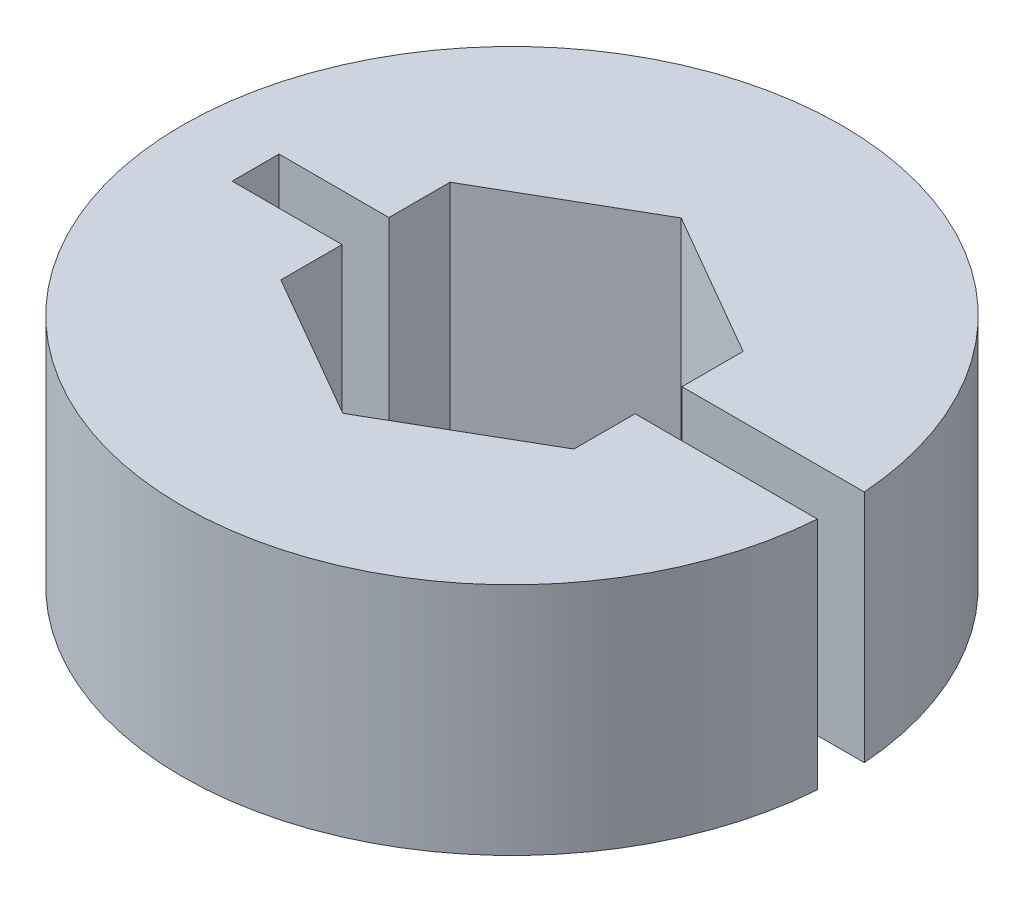
ISO-10303-21;
HEADER;
FILE_DESCRIPTION(('STEP AP214'),'2;1');
FILE_NAME('part.step','',(''),(''),'','','');
FILE_SCHEMA(('AUTOMOTIVE_DESIGN { 1 0 10303 214 1 1 1 1 }'));
ENDSEC;
DATA;
#1=APPLICATION_CONTEXT('core data for automotive mechanical design processes');
#2=APPLICATION_PROTOCOL_DEFINITION('international standard','automotive_design',2000,#1);
#3=PRODUCT_CONTEXT('',#1,'mechanical');
#4=PRODUCT('Part','Part','',(#3));
#5=PRODUCT_RELATED_PRODUCT_CATEGORY('part','',(#4));
#6=PRODUCT_DEFINITION_FORMATION('','',#4);
#7=PRODUCT_DEFINITION_CONTEXT('part definition',#1,'design');
#8=PRODUCT_DEFINITION('design','',#6,#7);
#9=PRODUCT_DEFINITION_SHAPE('','',#8);
#10=(LENGTH_UNIT() NAMED_UNIT(*) SI_UNIT(.MILLI.,.METRE.));
#11=(NAMED_UNIT(*) PLANE_ANGLE_UNIT() SI_UNIT($,.RADIAN.));
#12=(NAMED_UNIT(*) SI_UNIT($,.STERADIAN.) SOLID_ANGLE_UNIT());
#13=UNCERTAINTY_MEASURE_WITH_UNIT(LENGTH_MEASURE(1.E-05),#10,'distance_accuracy_value','');
#14=(GEOMETRIC_REPRESENTATION_CONTEXT(3) GLOBAL_UNCERTAINTY_ASSIGNED_CONTEXT((#13)) GLOBAL_UNIT_ASSIGNED_CONTEXT((#10,
#11,#12)) REPRESENTATION_CONTEXT('',''));
#15=CARTESIAN_POINT('',(0.,0.,0.));
#16=DIRECTION('',(0.,0.,1.));
#17=DIRECTION('',(1.,0.,0.));
#18=AXIS2_PLACEMENT_3D('',#15,#16,#17);
#19=CARTESIAN_POINT('',(0.,10.16,0.));
#20=DIRECTION('',(0.,-1.,0.));
#21=DIRECTION('',(0.,0.,-1.));
#22=AXIS2_PLACEMENT_3D('',#19,#20,#21);
#23=CYLINDRICAL_SURFACE('',#22,14.2875);
#24=DIRECTION('',(0.,-1.,0.));
#25=VECTOR('',#24,1.);
#26=CARTESIAN_POINT('',(14.251329771288,10.16,-1.016));
#27=LINE('',#26,#25);
#28=CARTESIAN_POINT('',(14.251329771288,0.,-1.016));
#29=VERTEX_POINT('',#28);
#30=CARTESIAN_POINT('',(14.251329771288,10.16,-1.016));
#31=VERTEX_POINT('',#30);
#32=EDGE_CURVE('E199',#29,#31,#27,.F.);
#33=ORIENTED_EDGE('',*,*,#32,.F.);
#34=CARTESIAN_POINT('',(0.,0.,0.));
#35=DIRECTION('',(0.,1.,0.));
#36=DIRECTION('',(0.,0.,1.));
#37=AXIS2_PLACEMENT_3D('',#34,#35,#36);
#38=CIRCLE('',#37,14.2875);
#39=CARTESIAN_POINT('',(14.251329771288,0.,1.016));
#40=VERTEX_POINT('',#39);
#41=EDGE_CURVE('E255',#29,#40,#38,.T.);
#42=ORIENTED_EDGE('',*,*,#41,.T.);
#43=DIRECTION('',(0.,-1.,0.));
#44=VECTOR('',#43,1.);
#45=CARTESIAN_POINT('',(14.251329771288,10.16,1.016));
#46=LINE('',#45,#44);
#47=CARTESIAN_POINT('',(14.251329771288,10.16,1.016));
#48=VERTEX_POINT('',#47);
#49=EDGE_CURVE('E192',#40,#48,#46,.F.);
#50=ORIENTED_EDGE('',*,*,#49,.T.);
#51=CARTESIAN_POINT('',(0.,10.16,0.));
#52=DIRECTION('',(0.,1.,0.));
#53=DIRECTION('',(0.,0.,1.));
#54=AXIS2_PLACEMENT_3D('',#51,#52,#53);
#55=CIRCLE('',#54,14.2875);
#56=EDGE_CURVE('E272',#31,#48,#55,.T.);
#57=ORIENTED_EDGE('',*,*,#56,.F.);
#58=EDGE_LOOP('',(#33,#42,#50,#57));
#59=FACE_BOUND('',#58,.T.);
#60=ADVANCED_FACE('F43',(#59),#23,.T.);
#61=CARTESIAN_POINT('',(0.,10.16,0.));
#62=DIRECTION('',(0.,1.,0.));
#63=DIRECTION('',(0.,0.,1.));
#64=AXIS2_PLACEMENT_3D('',#61,#62,#63);
#65=PLANE('',#64);
#66=DIRECTION('',(0.,0.,-1.));
#67=VECTOR('',#66,1.);
#68=CARTESIAN_POINT('',(6.35000000000001,10.16,3.66617420935413));
#69=LINE('',#68,#67);
#70=CARTESIAN_POINT('',(6.35000000000001,10.16,-1.016));
#71=VERTEX_POINT('',#70);
#72=CARTESIAN_POINT('',(6.35000000000001,10.16,-3.66617420935413));
#73=VERTEX_POINT('',#72);
#74=EDGE_CURVE('E247',#71,#73,#69,.T.);
#75=ORIENTED_EDGE('',*,*,#74,.F.);
#76=DIRECTION('',(1.,0.,0.));
#77=VECTOR('',#76,1.);
#78=CARTESIAN_POINT('',(-11.1125,10.16,-1.016));
#79=LINE('',#78,#77);
#80=EDGE_CURVE('E66',#71,#31,#79,.T.);
#81=ORIENTED_EDGE('',*,*,#80,.T.);
#82=ORIENTED_EDGE('',*,*,#56,.T.);
#83=DIRECTION('',(1.,0.,0.));
#84=VECTOR('',#83,1.);
#85=CARTESIAN_POINT('',(-11.1125,10.16,1.016));
#86=LINE('',#85,#84);
#87=CARTESIAN_POINT('',(6.35000000000001,10.16,1.016));
#88=VERTEX_POINT('',#87);
#89=EDGE_CURVE('E185',#88,#48,#86,.T.);
#90=ORIENTED_EDGE('',*,*,#89,.F.);
#91=CARTESIAN_POINT('',(6.35000000000001,10.16,3.66617420935413));
#92=VERTEX_POINT('',#91);
#93=EDGE_CURVE('E208',#92,#88,#69,.T.);
#94=ORIENTED_EDGE('',*,*,#93,.F.);
#95=DIRECTION('',(0.866025403784439,0.,-0.499999999999999));
#96=VECTOR('',#95,1.);
#97=CARTESIAN_POINT('',(0.,10.16,7.33234841870825));
#98=LINE('',#97,#96);
#99=CARTESIAN_POINT('',(0.,10.16,7.33234841870825));
#100=VERTEX_POINT('',#99);
#101=EDGE_CURVE('E243',#100,#92,#98,.T.);
#102=ORIENTED_EDGE('',*,*,#101,.F.);
#103=DIRECTION('',(0.866025403784439,0.,0.5));
#104=VECTOR('',#103,1.);
#105=CARTESIAN_POINT('',(-6.35,10.16,3.66617420935413));
#106=LINE('',#105,#104);
#107=CARTESIAN_POINT('',(-6.35,10.16,3.66617420935413));
#108=VERTEX_POINT('',#107);
#109=EDGE_CURVE('E239',#108,#100,#106,.T.);
#110=ORIENTED_EDGE('',*,*,#109,.F.);
#111=DIRECTION('',(0.,0.,1.));
#112=VECTOR('',#111,1.);
#113=CARTESIAN_POINT('',(-6.35000000000001,10.16,-3.66617420935413));
#114=LINE('',#113,#112);
#115=CARTESIAN_POINT('',(-6.35,10.16,1.016));
#116=VERTEX_POINT('',#115);
#117=EDGE_CURVE('E234',#116,#108,#114,.T.);
#118=ORIENTED_EDGE('',*,*,#117,.F.);
#119=CARTESIAN_POINT('',(-11.1125,10.16,1.016));
#120=VERTEX_POINT('',#119);
#121=EDGE_CURVE('E156',#120,#116,#86,.T.);
#122=ORIENTED_EDGE('',*,*,#121,.F.);
#123=DIRECTION('',(0.,0.,-1.));
#124=VECTOR('',#123,1.);
#125=CARTESIAN_POINT('',(-11.1125,10.16,1.016));
#126=LINE('',#125,#124);
#127=CARTESIAN_POINT('',(-11.1125,10.16,-1.016));
#128=VERTEX_POINT('',#127);
#129=EDGE_CURVE('E180',#120,#128,#126,.T.);
#130=ORIENTED_EDGE('',*,*,#129,.T.);
#131=CARTESIAN_POINT('',(-6.35,10.16,-1.016));
#132=VERTEX_POINT('',#131);
#133=EDGE_CURVE('E163',#128,#132,#79,.T.);
#134=ORIENTED_EDGE('',*,*,#133,.T.);
#135=CARTESIAN_POINT('',(-6.35000000000001,10.16,-3.66617420935413));
#136=VERTEX_POINT('',#135);
#137=EDGE_CURVE('E235',#136,#132,#114,.T.);
#138=ORIENTED_EDGE('',*,*,#137,.F.);
#139=DIRECTION('',(-0.866025403784439,0.,0.5));
#140=VECTOR('',#139,1.);
#141=CARTESIAN_POINT('',(0.,10.16,-7.33234841870825));
#142=LINE('',#141,#140);
#143=CARTESIAN_POINT('',(0.,10.16,-7.33234841870825));
#144=VERTEX_POINT('',#143);
#145=EDGE_CURVE('E230',#144,#136,#142,.T.);
#146=ORIENTED_EDGE('',*,*,#145,.F.);
#147=DIRECTION('',(-0.866025403784439,0.,-0.5));
#148=VECTOR('',#147,1.);
#149=CARTESIAN_POINT('',(6.35000000000001,10.16,-3.66617420935413));
#150=LINE('',#149,#148);
#151=EDGE_CURVE('E202',#73,#144,#150,.T.);
#152=ORIENTED_EDGE('',*,*,#151,.F.);
#153=EDGE_LOOP('',(#75,#81,#82,#90,#94,#102,#110,#118,#122,#130,#134,#138,#146,#152));
#154=FACE_BOUND('',#153,.T.);
#155=ADVANCED_FACE('F290',(#154),#65,.T.);
#156=CARTESIAN_POINT('',(0.,0.,0.));
#157=DIRECTION('',(0.,1.,0.));
#158=DIRECTION('',(0.,0.,1.));
#159=AXIS2_PLACEMENT_3D('',#156,#157,#158);
#160=PLANE('',#159);
#161=DIRECTION('',(1.,0.,0.));
#162=VECTOR('',#161,1.);
#163=CARTESIAN_POINT('',(-11.1125,0.,-1.016));
#164=LINE('',#163,#162);
#165=CARTESIAN_POINT('',(6.35000000000001,0.,-1.016));
#166=VERTEX_POINT('',#165);
#167=EDGE_CURVE('E155',#166,#29,#164,.T.);
#168=ORIENTED_EDGE('',*,*,#167,.F.);
#169=DIRECTION('',(0.,0.,-1.));
#170=VECTOR('',#169,1.);
#171=CARTESIAN_POINT('',(6.35000000000001,0.,3.66617420935413));
#172=LINE('',#171,#170);
#173=CARTESIAN_POINT('',(6.35000000000001,0.,-3.66617420935413));
#174=VERTEX_POINT('',#173);
#175=EDGE_CURVE('E222',#166,#174,#172,.T.);
#176=ORIENTED_EDGE('',*,*,#175,.T.);
#177=DIRECTION('',(-0.866025403784439,0.,-0.5));
#178=VECTOR('',#177,1.);
#179=CARTESIAN_POINT('',(6.35000000000001,0.,-3.66617420935413));
#180=LINE('',#179,#178);
#181=CARTESIAN_POINT('',(0.,0.,-7.33234841870825));
#182=VERTEX_POINT('',#181);
#183=EDGE_CURVE('E203',#174,#182,#180,.T.);
#184=ORIENTED_EDGE('',*,*,#183,.T.);
#185=DIRECTION('',(-0.866025403784439,0.,0.5));
#186=VECTOR('',#185,1.);
#187=CARTESIAN_POINT('',(0.,0.,-7.33234841870825));
#188=LINE('',#187,#186);
#189=CARTESIAN_POINT('',(-6.35,0.,-3.66617420935413));
#190=VERTEX_POINT('',#189);
#191=EDGE_CURVE('E207',#182,#190,#188,.T.);
#192=ORIENTED_EDGE('',*,*,#191,.T.);
#193=DIRECTION('',(0.,0.,1.));
#194=VECTOR('',#193,1.);
#195=CARTESIAN_POINT('',(-6.35000000000001,0.,-3.66617420935413));
#196=LINE('',#195,#194);
#197=CARTESIAN_POINT('',(-6.35,0.,-1.016));
#198=VERTEX_POINT('',#197);
#199=EDGE_CURVE('E171',#190,#198,#196,.T.);
#200=ORIENTED_EDGE('',*,*,#199,.T.);
#201=CARTESIAN_POINT('',(-11.1125,0.,-1.016));
#202=VERTEX_POINT('',#201);
#203=EDGE_CURVE('E160',#202,#198,#164,.T.);
#204=ORIENTED_EDGE('',*,*,#203,.F.);
#205=DIRECTION('',(0.,0.,-1.));
#206=VECTOR('',#205,1.);
#207=CARTESIAN_POINT('',(-11.1125,0.,1.016));
#208=LINE('',#207,#206);
#209=CARTESIAN_POINT('',(-11.1125,0.,1.016));
#210=VERTEX_POINT('',#209);
#211=EDGE_CURVE('E143',#210,#202,#208,.T.);
#212=ORIENTED_EDGE('',*,*,#211,.F.);
#213=DIRECTION('',(1.,0.,0.));
#214=VECTOR('',#213,1.);
#215=CARTESIAN_POINT('',(-11.1125,0.,1.016));
#216=LINE('',#215,#214);
#217=CARTESIAN_POINT('',(-6.35,0.,1.016));
#218=VERTEX_POINT('',#217);
#219=EDGE_CURVE('E176',#210,#218,#216,.T.);
#220=ORIENTED_EDGE('',*,*,#219,.T.);
#221=CARTESIAN_POINT('',(-6.35,0.,3.66617420935413));
#222=VERTEX_POINT('',#221);
#223=EDGE_CURVE('E211',#218,#222,#196,.T.);
#224=ORIENTED_EDGE('',*,*,#223,.T.);
#225=DIRECTION('',(0.866025403784439,0.,0.5));
#226=VECTOR('',#225,1.);
#227=CARTESIAN_POINT('',(-6.35,0.,3.66617420935413));
#228=LINE('',#227,#226);
#229=CARTESIAN_POINT('',(0.,0.,7.33234841870825));
#230=VERTEX_POINT('',#229);
#231=EDGE_CURVE('E214',#222,#230,#228,.T.);
#232=ORIENTED_EDGE('',*,*,#231,.T.);
#233=DIRECTION('',(0.866025403784439,0.,-0.499999999999999));
#234=VECTOR('',#233,1.);
#235=CARTESIAN_POINT('',(0.,0.,7.33234841870825));
#236=LINE('',#235,#234);
#237=CARTESIAN_POINT('',(6.35000000000001,0.,3.66617420935413));
#238=VERTEX_POINT('',#237);
#239=EDGE_CURVE('E218',#230,#238,#236,.T.);
#240=ORIENTED_EDGE('',*,*,#239,.T.);
#241=CARTESIAN_POINT('',(6.35000000000001,0.,1.016));
#242=VERTEX_POINT('',#241);
#243=EDGE_CURVE('E223',#238,#242,#172,.T.);
#244=ORIENTED_EDGE('',*,*,#243,.T.);
#245=EDGE_CURVE('E58',#242,#40,#216,.T.);
#246=ORIENTED_EDGE('',*,*,#245,.T.);
#247=ORIENTED_EDGE('',*,*,#41,.F.);
#248=EDGE_LOOP('',(#168,#176,#184,#192,#200,#204,#212,#220,#224,#232,#240,#244,#246,#247));
#249=FACE_BOUND('',#248,.T.);
#250=ADVANCED_FACE('F169',(#249),#160,.F.);
#251=CARTESIAN_POINT('',(6.35000000000001,0.,3.66617420935413));
#252=DIRECTION('',(1.,0.,0.));
#253=DIRECTION('',(0.,0.,-1.));
#254=AXIS2_PLACEMENT_3D('',#251,#252,#253);
#255=PLANE('',#254);
#256=DIRECTION('',(0.,-1.,0.));
#257=VECTOR('',#256,1.);
#258=CARTESIAN_POINT('',(6.35000000000001,0.,-1.016));
#259=LINE('',#258,#257);
#260=EDGE_CURVE('E196',#71,#166,#259,.T.);
#261=ORIENTED_EDGE('',*,*,#260,.F.);
#262=ORIENTED_EDGE('',*,*,#74,.T.);
#263=DIRECTION('',(0.,1.,0.));
#264=VECTOR('',#263,1.);
#265=CARTESIAN_POINT('',(6.35000000000001,0.,-3.66617420935413));
#266=LINE('',#265,#264);
#267=EDGE_CURVE('E251',#174,#73,#266,.T.);
#268=ORIENTED_EDGE('',*,*,#267,.F.);
#269=ORIENTED_EDGE('',*,*,#175,.F.);
#270=EDGE_LOOP('',(#261,#262,#268,#269));
#271=FACE_BOUND('',#270,.T.);
#272=ADVANCED_FACE('F301',(#271),#255,.F.);
#273=CARTESIAN_POINT('',(-6.35000000000001,0.,-3.66617420935413));
#274=DIRECTION('',(-1.,0.,0.));
#275=DIRECTION('',(0.,0.,1.));
#276=AXIS2_PLACEMENT_3D('',#273,#274,#275);
#277=PLANE('',#276);
#278=DIRECTION('',(0.,1.,0.));
#279=VECTOR('',#278,1.);
#280=CARTESIAN_POINT('',(-6.35000000000001,0.,-1.016));
#281=LINE('',#280,#279);
#282=EDGE_CURVE('E11',#198,#132,#281,.T.);
#283=ORIENTED_EDGE('',*,*,#282,.F.);
#284=ORIENTED_EDGE('',*,*,#199,.F.);
#285=DIRECTION('',(0.,1.,0.));
#286=VECTOR('',#285,1.);
#287=CARTESIAN_POINT('',(-6.35000000000001,0.,-3.66617420935413));
#288=LINE('',#287,#286);
#289=EDGE_CURVE('E266',#190,#136,#288,.T.);
#290=ORIENTED_EDGE('',*,*,#289,.T.);
#291=ORIENTED_EDGE('',*,*,#137,.T.);
#292=EDGE_LOOP('',(#283,#284,#290,#291));
#293=FACE_BOUND('',#292,.T.);
#294=ADVANCED_FACE('F312',(#293),#277,.F.);
#295=CARTESIAN_POINT('',(6.35000000000001,0.,-3.66617420935413));
#296=DIRECTION('',(0.5,0.,-0.866025403784439));
#297=DIRECTION('',(-0.866025403784439,0.,-0.5));
#298=AXIS2_PLACEMENT_3D('',#295,#296,#297);
#299=PLANE('',#298);
#300=ORIENTED_EDGE('',*,*,#151,.T.);
#301=DIRECTION('',(0.,1.,0.));
#302=VECTOR('',#301,1.);
#303=CARTESIAN_POINT('',(0.,0.,-7.33234841870825));
#304=LINE('',#303,#302);
#305=EDGE_CURVE('E227',#182,#144,#304,.T.);
#306=ORIENTED_EDGE('',*,*,#305,.F.);
#307=ORIENTED_EDGE('',*,*,#183,.F.);
#308=ORIENTED_EDGE('',*,*,#267,.T.);
#309=EDGE_LOOP('',(#300,#306,#307,#308));
#310=FACE_BOUND('',#309,.T.);
#311=ADVANCED_FACE('F304',(#310),#299,.F.);
#312=ORIENTED_EDGE('',*,*,#93,.T.);
#313=DIRECTION('',(0.,-1.,0.));
#314=VECTOR('',#313,1.);
#315=CARTESIAN_POINT('',(6.35000000000001,0.,1.016));
#316=LINE('',#315,#314);
#317=EDGE_CURVE('E165',#88,#242,#316,.T.);
#318=ORIENTED_EDGE('',*,*,#317,.T.);
#319=ORIENTED_EDGE('',*,*,#243,.F.);
#320=DIRECTION('',(0.,1.,0.));
#321=VECTOR('',#320,1.);
#322=CARTESIAN_POINT('',(6.35000000000001,0.,3.66617420935413));
#323=LINE('',#322,#321);
#324=EDGE_CURVE('E256',#238,#92,#323,.T.);
#325=ORIENTED_EDGE('',*,*,#324,.T.);
#326=EDGE_LOOP('',(#312,#318,#319,#325));
#327=FACE_BOUND('',#326,.T.);
#328=ADVANCED_FACE('F322',(#327),#255,.F.);
#329=CARTESIAN_POINT('',(0.,0.,7.33234841870825));
#330=DIRECTION('',(0.5,0.,0.866025403784439));
#331=DIRECTION('',(0.866025403784439,0.,-0.5));
#332=AXIS2_PLACEMENT_3D('',#329,#330,#331);
#333=PLANE('',#332);
#334=ORIENTED_EDGE('',*,*,#101,.T.);
#335=ORIENTED_EDGE('',*,*,#324,.F.);
#336=ORIENTED_EDGE('',*,*,#239,.F.);
#337=DIRECTION('',(0.,1.,0.));
#338=VECTOR('',#337,1.);
#339=CARTESIAN_POINT('',(0.,0.,7.33234841870825));
#340=LINE('',#339,#338);
#341=EDGE_CURVE('E259',#230,#100,#340,.T.);
#342=ORIENTED_EDGE('',*,*,#341,.T.);
#343=EDGE_LOOP('',(#334,#335,#336,#342));
#344=FACE_BOUND('',#343,.T.);
#345=ADVANCED_FACE('F326',(#344),#333,.F.);
#346=CARTESIAN_POINT('',(-6.35,0.,3.66617420935413));
#347=DIRECTION('',(-0.5,0.,0.866025403784439));
#348=DIRECTION('',(0.866025403784439,0.,0.5));
#349=AXIS2_PLACEMENT_3D('',#346,#347,#348);
#350=PLANE('',#349);
#351=ORIENTED_EDGE('',*,*,#109,.T.);
#352=ORIENTED_EDGE('',*,*,#341,.F.);
#353=ORIENTED_EDGE('',*,*,#231,.F.);
#354=DIRECTION('',(0.,1.,0.));
#355=VECTOR('',#354,1.);
#356=CARTESIAN_POINT('',(-6.35,0.,3.66617420935413));
#357=LINE('',#356,#355);
#358=EDGE_CURVE('E262',#222,#108,#357,.T.);
#359=ORIENTED_EDGE('',*,*,#358,.T.);
#360=EDGE_LOOP('',(#351,#352,#353,#359));
#361=FACE_BOUND('',#360,.T.);
#362=ADVANCED_FACE('F329',(#361),#350,.F.);
#363=ORIENTED_EDGE('',*,*,#223,.F.);
#364=DIRECTION('',(0.,1.,0.));
#365=VECTOR('',#364,1.);
#366=CARTESIAN_POINT('',(-6.35,0.,1.016));
#367=LINE('',#366,#365);
#368=EDGE_CURVE('E51',#218,#116,#367,.T.);
#369=ORIENTED_EDGE('',*,*,#368,.T.);
#370=ORIENTED_EDGE('',*,*,#117,.T.);
#371=ORIENTED_EDGE('',*,*,#358,.F.);
#372=EDGE_LOOP('',(#363,#369,#370,#371));
#373=FACE_BOUND('',#372,.T.);
#374=ADVANCED_FACE('F283',(#373),#277,.F.);
#375=CARTESIAN_POINT('',(0.,0.,-7.33234841870825));
#376=DIRECTION('',(-0.5,0.,-0.866025403784439));
#377=DIRECTION('',(-0.866025403784439,0.,0.5));
#378=AXIS2_PLACEMENT_3D('',#375,#376,#377);
#379=PLANE('',#378);
#380=ORIENTED_EDGE('',*,*,#145,.T.);
#381=ORIENTED_EDGE('',*,*,#289,.F.);
#382=ORIENTED_EDGE('',*,*,#191,.F.);
#383=ORIENTED_EDGE('',*,*,#305,.T.);
#384=EDGE_LOOP('',(#380,#381,#382,#383));
#385=FACE_BOUND('',#384,.T.);
#386=ADVANCED_FACE('F309',(#385),#379,.F.);
#387=CARTESIAN_POINT('',(-11.1125,0.,1.016));
#388=DIRECTION('',(0.,0.,1.));
#389=DIRECTION('',(1.,0.,0.));
#390=AXIS2_PLACEMENT_3D('',#387,#388,#389);
#391=PLANE('',#390);
#392=ORIENTED_EDGE('',*,*,#219,.F.);
#393=DIRECTION('',(0.,1.,0.));
#394=VECTOR('',#393,1.);
#395=CARTESIAN_POINT('',(-11.1125,0.,1.016));
#396=LINE('',#395,#394);
#397=EDGE_CURVE('E149',#210,#120,#396,.T.);
#398=ORIENTED_EDGE('',*,*,#397,.T.);
#399=ORIENTED_EDGE('',*,*,#121,.T.);
#400=ORIENTED_EDGE('',*,*,#368,.F.);
#401=EDGE_LOOP('',(#392,#398,#399,#400));
#402=FACE_BOUND('',#401,.T.);
#403=ADVANCED_FACE('F330',(#402),#391,.F.);
#404=CARTESIAN_POINT('',(-11.1125,0.,-1.016));
#405=DIRECTION('',(0.,0.,1.));
#406=DIRECTION('',(1.,0.,0.));
#407=AXIS2_PLACEMENT_3D('',#404,#405,#406);
#408=PLANE('',#407);
#409=ORIENTED_EDGE('',*,*,#282,.T.);
#410=ORIENTED_EDGE('',*,*,#133,.F.);
#411=DIRECTION('',(0.,1.,0.));
#412=VECTOR('',#411,1.);
#413=CARTESIAN_POINT('',(-11.1125,0.,-1.016));
#414=LINE('',#413,#412);
#415=EDGE_CURVE('E147',#202,#128,#414,.T.);
#416=ORIENTED_EDGE('',*,*,#415,.F.);
#417=ORIENTED_EDGE('',*,*,#203,.T.);
#418=EDGE_LOOP('',(#409,#410,#416,#417));
#419=FACE_BOUND('',#418,.T.);
#420=ADVANCED_FACE('F159',(#419),#408,.T.);
#421=CARTESIAN_POINT('',(-11.1125,0.,1.016));
#422=DIRECTION('',(1.,0.,0.));
#423=DIRECTION('',(0.,0.,-1.));
#424=AXIS2_PLACEMENT_3D('',#421,#422,#423);
#425=PLANE('',#424);
#426=ORIENTED_EDGE('',*,*,#129,.F.);
#427=ORIENTED_EDGE('',*,*,#397,.F.);
#428=ORIENTED_EDGE('',*,*,#211,.T.);
#429=ORIENTED_EDGE('',*,*,#415,.T.);
#430=EDGE_LOOP('',(#426,#427,#428,#429));
#431=FACE_BOUND('',#430,.T.);
#432=ADVANCED_FACE('F146',(#431),#425,.T.);
#433=ORIENTED_EDGE('',*,*,#245,.F.);
#434=ORIENTED_EDGE('',*,*,#317,.F.);
#435=ORIENTED_EDGE('',*,*,#89,.T.);
#436=ORIENTED_EDGE('',*,*,#49,.F.);
#437=EDGE_LOOP('',(#433,#434,#435,#436));
#438=FACE_BOUND('',#437,.T.);
#439=ADVANCED_FACE('F318',(#438),#391,.F.);
#440=ORIENTED_EDGE('',*,*,#32,.T.);
#441=ORIENTED_EDGE('',*,*,#80,.F.);
#442=ORIENTED_EDGE('',*,*,#260,.T.);
#443=ORIENTED_EDGE('',*,*,#167,.T.);
#444=EDGE_LOOP('',(#440,#441,#442,#443));
#445=FACE_BOUND('',#444,.T.);
#446=ADVANCED_FACE('F338',(#445),#408,.T.);
#447=CLOSED_SHELL('',(#60,#155,#250,#272,#294,#311,#328,#345,#362,#374,#386,#403,#420,#432,#439,#446));
#448=MANIFOLD_SOLID_BREP('B2',#447);
#449=ADVANCED_BREP_SHAPE_REPRESENTATION('',(#18,#448),#14);
#450=SHAPE_DEFINITION_REPRESENTATION(#9,#449);
ENDSEC;
END-ISO-10303-21;
